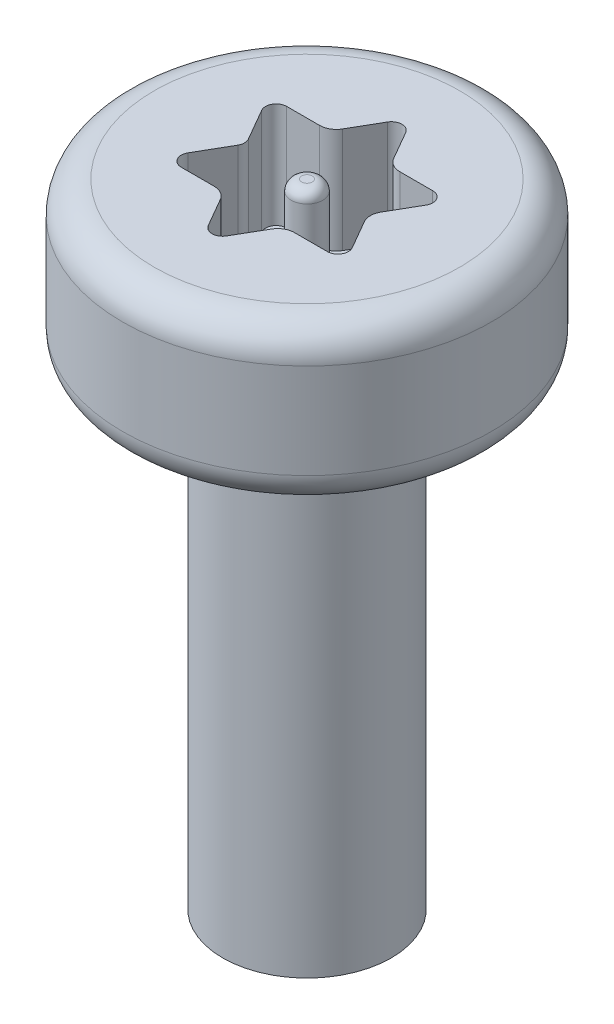
ISO-10303-21;
HEADER;
FILE_DESCRIPTION(('STEP AP214'),'2;1');
FILE_NAME('part.step','',(''),(''),'','','');
FILE_SCHEMA(('AUTOMOTIVE_DESIGN { 1 0 10303 214 1 1 1 1 }'));
ENDSEC;
DATA;
#1=APPLICATION_CONTEXT('core data for automotive mechanical design processes');
#2=APPLICATION_PROTOCOL_DEFINITION('international standard','automotive_design',2000,#1);
#3=PRODUCT_CONTEXT('',#1,'mechanical');
#4=PRODUCT('Part','Part','',(#3));
#5=PRODUCT_RELATED_PRODUCT_CATEGORY('part','',(#4));
#6=PRODUCT_DEFINITION_FORMATION('','',#4);
#7=PRODUCT_DEFINITION_CONTEXT('part definition',#1,'design');
#8=PRODUCT_DEFINITION('design','',#6,#7);
#9=PRODUCT_DEFINITION_SHAPE('','',#8);
#10=(LENGTH_UNIT() NAMED_UNIT(*) SI_UNIT(.MILLI.,.METRE.));
#11=(NAMED_UNIT(*) PLANE_ANGLE_UNIT() SI_UNIT($,.RADIAN.));
#12=(NAMED_UNIT(*) SI_UNIT($,.STERADIAN.) SOLID_ANGLE_UNIT());
#13=UNCERTAINTY_MEASURE_WITH_UNIT(LENGTH_MEASURE(1.E-05),#10,'distance_accuracy_value','');
#14=(GEOMETRIC_REPRESENTATION_CONTEXT(3) GLOBAL_UNCERTAINTY_ASSIGNED_CONTEXT((#13)) GLOBAL_UNIT_ASSIGNED_CONTEXT((#10,
#11,#12)) REPRESENTATION_CONTEXT('',''));
#15=CARTESIAN_POINT('',(0.,0.,0.));
#16=DIRECTION('',(0.,0.,1.));
#17=DIRECTION('',(1.,0.,0.));
#18=AXIS2_PLACEMENT_3D('',#15,#16,#17);
#19=CARTESIAN_POINT('',(0.,0.,0.));
#20=DIRECTION('',(0.,1.,0.));
#21=DIRECTION('',(0.,0.,1.));
#22=AXIS2_PLACEMENT_3D('',#19,#20,#21);
#23=PLANE('',#22);
#24=CARTESIAN_POINT('',(0.,0.,0.));
#25=DIRECTION('',(0.,1.,0.));
#26=DIRECTION('',(0.,0.,1.));
#27=AXIS2_PLACEMENT_3D('',#24,#25,#26);
#28=CIRCLE('',#27,1.45);
#29=CARTESIAN_POINT('',(0.,0.,1.45));
#30=VERTEX_POINT('',#29);
#31=EDGE_CURVE('E378',#30,#30,#28,.F.);
#32=ORIENTED_EDGE('',*,*,#31,.T.);
#33=EDGE_LOOP('',(#32));
#34=FACE_BOUND('',#33,.T.);
#35=CARTESIAN_POINT('',(0.,0.,0.));
#36=DIRECTION('',(0.,1.,0.));
#37=DIRECTION('',(0.,0.,1.));
#38=AXIS2_PLACEMENT_3D('',#35,#36,#37);
#39=CIRCLE('',#38,0.8);
#40=CARTESIAN_POINT('',(0.,0.,0.8));
#41=VERTEX_POINT('',#40);
#42=EDGE_CURVE('E369',#41,#41,#39,.F.);
#43=ORIENTED_EDGE('',*,*,#42,.F.);
#44=EDGE_LOOP('',(#43));
#45=FACE_BOUND('',#44,.T.);
#46=ADVANCED_FACE('F16',(#34,#45),#23,.F.);
#47=CARTESIAN_POINT('',(0.,0.5,0.));
#48=DIRECTION('',(0.,1.,0.));
#49=DIRECTION('',(0.,0.,1.));
#50=AXIS2_PLACEMENT_3D('',#47,#48,#49);
#51=PLANE('',#50);
#52=DIRECTION('',(-0.5,0.,-0.86602540378444));
#53=VECTOR('',#52,1.);
#54=CARTESIAN_POINT('',(-0.43301270189222,0.5,0.25));
#55=LINE('',#54,#53);
#56=CARTESIAN_POINT('',(-0.606217782649111,0.5,-0.0500000000000079));
#57=VERTEX_POINT('',#56);
#58=CARTESIAN_POINT('',(-0.779422863405994,0.5,-0.35));
#59=VERTEX_POINT('',#58);
#60=EDGE_CURVE('E203',#57,#59,#55,.T.);
#61=ORIENTED_EDGE('',*,*,#60,.F.);
#62=CARTESIAN_POINT('',(-0.692820323027554,0.5,0.));
#63=DIRECTION('',(0.,1.,0.));
#64=DIRECTION('',(0.,0.,1.));
#65=AXIS2_PLACEMENT_3D('',#62,#63,#64);
#66=CIRCLE('',#65,0.1);
#67=CARTESIAN_POINT('',(-0.606217782649111,0.5,0.0499999999999924));
#68=VERTEX_POINT('',#67);
#69=EDGE_CURVE('E201',#57,#68,#66,.F.);
#70=ORIENTED_EDGE('',*,*,#69,.T.);
#71=DIRECTION('',(-0.50000000000001,0.,0.866025403784433));
#72=VECTOR('',#71,1.);
#73=CARTESIAN_POINT('',(-0.43301270189222,0.5,-0.250000000000006));
#74=LINE('',#73,#72);
#75=CARTESIAN_POINT('',(-0.779422863405999,0.5,0.349999999999986));
#76=VERTEX_POINT('',#75);
#77=EDGE_CURVE('E183',#68,#76,#74,.T.);
#78=ORIENTED_EDGE('',*,*,#77,.T.);
#79=CARTESIAN_POINT('',(-0.692820323027556,0.5,0.399999999999987));
#80=DIRECTION('',(0.,1.,0.));
#81=DIRECTION('',(0.,0.,1.));
#82=AXIS2_PLACEMENT_3D('',#79,#80,#81);
#83=CIRCLE('',#82,0.1);
#84=CARTESIAN_POINT('',(-0.692820323027556,0.5,0.499999999999987));
#85=VERTEX_POINT('',#84);
#86=EDGE_CURVE('E192',#76,#85,#83,.T.);
#87=ORIENTED_EDGE('',*,*,#86,.T.);
#88=DIRECTION('',(1.,0.,0.));
#89=VECTOR('',#88,1.);
#90=CARTESIAN_POINT('',(0.,0.5,0.499999999999987));
#91=LINE('',#90,#89);
#92=CARTESIAN_POINT('',(-0.38043258809103,0.5,0.499999999999987));
#93=VERTEX_POINT('',#92);
#94=EDGE_CURVE('E31',#85,#93,#91,.T.);
#95=ORIENTED_EDGE('',*,*,#94,.T.);
#96=CARTESIAN_POINT('',(-0.380432588091029,0.5,0.658928571428559));
#97=DIRECTION('',(0.,1.,0.));
#98=DIRECTION('',(0.,0.,1.));
#99=AXIS2_PLACEMENT_3D('',#96,#97,#98);
#100=CIRCLE('',#99,0.158928571428572);
#101=CARTESIAN_POINT('',(-0.242796407846716,0.5,0.579464285714273));
#102=VERTEX_POINT('',#101);
#103=EDGE_CURVE('E39',#93,#102,#100,.F.);
#104=ORIENTED_EDGE('',*,*,#103,.T.);
#105=DIRECTION('',(-0.5,0.,-0.86602540378444));
#106=VECTOR('',#105,1.);
#107=CARTESIAN_POINT('',(-0.43301270189222,0.5,0.25));
#108=LINE('',#107,#106);
#109=CARTESIAN_POINT('',(-0.0866025403784443,0.5,0.85));
#110=VERTEX_POINT('',#109);
#111=EDGE_CURVE('E209',#110,#102,#108,.T.);
#112=ORIENTED_EDGE('',*,*,#111,.F.);
#113=CARTESIAN_POINT('',(0.,0.5,0.8));
#114=DIRECTION('',(0.,1.,0.));
#115=DIRECTION('',(0.,0.,1.));
#116=AXIS2_PLACEMENT_3D('',#113,#114,#115);
#117=CIRCLE('',#116,0.1);
#118=CARTESIAN_POINT('',(0.0866025403784443,0.5,0.85));
#119=VERTEX_POINT('',#118);
#120=EDGE_CURVE('E211',#110,#119,#117,.T.);
#121=ORIENTED_EDGE('',*,*,#120,.T.);
#122=DIRECTION('',(-0.5,0.,0.86602540378444));
#123=VECTOR('',#122,1.);
#124=CARTESIAN_POINT('',(0.43301270189222,0.5,0.25));
#125=LINE('',#124,#123);
#126=CARTESIAN_POINT('',(0.242796407846716,0.5,0.579464285714273));
#127=VERTEX_POINT('',#126);
#128=EDGE_CURVE('E214',#127,#119,#125,.T.);
#129=ORIENTED_EDGE('',*,*,#128,.F.);
#130=CARTESIAN_POINT('',(0.380432588091029,0.5,0.658928571428559));
#131=DIRECTION('',(0.,1.,0.));
#132=DIRECTION('',(0.,0.,1.));
#133=AXIS2_PLACEMENT_3D('',#130,#131,#132);
#134=CIRCLE('',#133,0.158928571428572);
#135=CARTESIAN_POINT('',(0.38043258809103,0.5,0.499999999999987));
#136=VERTEX_POINT('',#135);
#137=EDGE_CURVE('E216',#127,#136,#134,.F.);
#138=ORIENTED_EDGE('',*,*,#137,.T.);
#139=DIRECTION('',(1.,0.,0.));
#140=VECTOR('',#139,1.);
#141=CARTESIAN_POINT('',(0.,0.5,0.499999999999987));
#142=LINE('',#141,#140);
#143=CARTESIAN_POINT('',(0.692820323027556,0.5,0.499999999999987));
#144=VERTEX_POINT('',#143);
#145=EDGE_CURVE('E219',#136,#144,#142,.T.);
#146=ORIENTED_EDGE('',*,*,#145,.T.);
#147=CARTESIAN_POINT('',(0.692820323027556,0.5,0.399999999999987));
#148=DIRECTION('',(0.,1.,0.));
#149=DIRECTION('',(0.,0.,1.));
#150=AXIS2_PLACEMENT_3D('',#147,#148,#149);
#151=CIRCLE('',#150,0.1);
#152=CARTESIAN_POINT('',(0.779422863405999,0.5,0.349999999999986));
#153=VERTEX_POINT('',#152);
#154=EDGE_CURVE('E222',#144,#153,#151,.T.);
#155=ORIENTED_EDGE('',*,*,#154,.T.);
#156=DIRECTION('',(-0.500000000000009,0.,-0.866025403784434));
#157=VECTOR('',#156,1.);
#158=CARTESIAN_POINT('',(0.43301270189222,0.5,-0.250000000000006));
#159=LINE('',#158,#157);
#160=CARTESIAN_POINT('',(0.623228995937734,0.5,0.0794642857142784));
#161=VERTEX_POINT('',#160);
#162=EDGE_CURVE('E225',#153,#161,#159,.T.);
#163=ORIENTED_EDGE('',*,*,#162,.T.);
#164=CARTESIAN_POINT('',(0.760865176182047,0.5,0.));
#165=DIRECTION('',(0.,1.,0.));
#166=DIRECTION('',(0.,0.,1.));
#167=AXIS2_PLACEMENT_3D('',#164,#165,#166);
#168=CIRCLE('',#167,0.158928571428572);
#169=CARTESIAN_POINT('',(0.623228995937734,0.5,-0.0794642857142939));
#170=VERTEX_POINT('',#169);
#171=EDGE_CURVE('E228',#161,#170,#168,.F.);
#172=ORIENTED_EDGE('',*,*,#171,.T.);
#173=DIRECTION('',(-0.5,0.,0.86602540378444));
#174=VECTOR('',#173,1.);
#175=CARTESIAN_POINT('',(0.43301270189222,0.5,0.25));
#176=LINE('',#175,#174);
#177=CARTESIAN_POINT('',(0.779422863405994,0.5,-0.35));
#178=VERTEX_POINT('',#177);
#179=EDGE_CURVE('E231',#178,#170,#176,.T.);
#180=ORIENTED_EDGE('',*,*,#179,.F.);
#181=CARTESIAN_POINT('',(0.692820323027549,0.5,-0.4));
#182=DIRECTION('',(0.,1.,0.));
#183=DIRECTION('',(0.,0.,1.));
#184=AXIS2_PLACEMENT_3D('',#181,#182,#183);
#185=CIRCLE('',#184,0.1);
#186=CARTESIAN_POINT('',(0.692820323027549,0.5,-0.5));
#187=VERTEX_POINT('',#186);
#188=EDGE_CURVE('E233',#178,#187,#185,.T.);
#189=ORIENTED_EDGE('',*,*,#188,.T.);
#190=DIRECTION('',(1.,0.,0.));
#191=VECTOR('',#190,1.);
#192=CARTESIAN_POINT('',(0.,0.5,-0.5));
#193=LINE('',#192,#191);
#194=CARTESIAN_POINT('',(0.380432588091023,0.5,-0.5));
#195=VERTEX_POINT('',#194);
#196=EDGE_CURVE('E236',#195,#187,#193,.T.);
#197=ORIENTED_EDGE('',*,*,#196,.F.);
#198=CARTESIAN_POINT('',(0.380432588091023,0.5,-0.658928571428573));
#199=DIRECTION('',(0.,1.,0.));
#200=DIRECTION('',(0.,0.,1.));
#201=AXIS2_PLACEMENT_3D('',#198,#199,#200);
#202=CIRCLE('',#201,0.158928571428571);
#203=CARTESIAN_POINT('',(0.242796407846711,0.5,-0.579464285714288));
#204=VERTEX_POINT('',#203);
#205=EDGE_CURVE('E238',#195,#204,#202,.F.);
#206=ORIENTED_EDGE('',*,*,#205,.T.);
#207=DIRECTION('',(-0.500000000000014,0.,-0.866025403784431));
#208=VECTOR('',#207,1.);
#209=CARTESIAN_POINT('',(0.433012701892223,0.5,-0.250000000000011));
#210=LINE('',#209,#208);
#211=CARTESIAN_POINT('',(0.0866025403784432,0.5,-0.85));
#212=VERTEX_POINT('',#211);
#213=EDGE_CURVE('E241',#204,#212,#210,.T.);
#214=ORIENTED_EDGE('',*,*,#213,.T.);
#215=CARTESIAN_POINT('',(0.,0.5,-0.8));
#216=DIRECTION('',(0.,1.,0.));
#217=DIRECTION('',(0.,0.,1.));
#218=AXIS2_PLACEMENT_3D('',#215,#216,#217);
#219=CIRCLE('',#218,0.1);
#220=CARTESIAN_POINT('',(-0.0866025403784435,0.5,-0.85));
#221=VERTEX_POINT('',#220);
#222=EDGE_CURVE('E244',#212,#221,#219,.T.);
#223=ORIENTED_EDGE('',*,*,#222,.T.);
#224=DIRECTION('',(-0.500000000000014,0.,0.866025403784431));
#225=VECTOR('',#224,1.);
#226=CARTESIAN_POINT('',(-0.433012701892223,0.5,-0.250000000000011));
#227=LINE('',#226,#225);
#228=CARTESIAN_POINT('',(-0.242796407846711,0.5,-0.579464285714288));
#229=VERTEX_POINT('',#228);
#230=EDGE_CURVE('E247',#221,#229,#227,.T.);
#231=ORIENTED_EDGE('',*,*,#230,.T.);
#232=CARTESIAN_POINT('',(-0.380432588091023,0.5,-0.658928571428574));
#233=DIRECTION('',(0.,1.,0.));
#234=DIRECTION('',(0.,0.,1.));
#235=AXIS2_PLACEMENT_3D('',#232,#233,#234);
#236=CIRCLE('',#235,0.158928571428572);
#237=CARTESIAN_POINT('',(-0.380432588091023,0.5,-0.5));
#238=VERTEX_POINT('',#237);
#239=EDGE_CURVE('E250',#229,#238,#236,.F.);
#240=ORIENTED_EDGE('',*,*,#239,.T.);
#241=DIRECTION('',(1.,0.,0.));
#242=VECTOR('',#241,1.);
#243=CARTESIAN_POINT('',(0.,0.5,-0.5));
#244=LINE('',#243,#242);
#245=CARTESIAN_POINT('',(-0.692820323027549,0.5,-0.5));
#246=VERTEX_POINT('',#245);
#247=EDGE_CURVE('E253',#246,#238,#244,.T.);
#248=ORIENTED_EDGE('',*,*,#247,.F.);
#249=CARTESIAN_POINT('',(-0.692820323027549,0.5,-0.4));
#250=DIRECTION('',(0.,1.,0.));
#251=DIRECTION('',(0.,0.,1.));
#252=AXIS2_PLACEMENT_3D('',#249,#250,#251);
#253=CIRCLE('',#252,0.1);
#254=EDGE_CURVE('E255',#246,#59,#253,.T.);
#255=ORIENTED_EDGE('',*,*,#254,.T.);
#256=EDGE_LOOP('',(#61,#70,#78,#87,#95,#104,#112,#121,#129,#138,#146,#155,#163,#172,#180,#189,
#197,#206,#214,#223,#231,#240,#248,#255));
#257=FACE_BOUND('',#256,.T.);
#258=CARTESIAN_POINT('',(0.,0.5,0.));
#259=DIRECTION('',(0.,1.,0.));
#260=DIRECTION('',(0.,0.,1.));
#261=AXIS2_PLACEMENT_3D('',#258,#259,#260);
#262=CIRCLE('',#261,0.15);
#263=CARTESIAN_POINT('',(0.,0.5,0.15));
#264=VERTEX_POINT('',#263);
#265=EDGE_CURVE('E523',#264,#264,#262,.T.);
#266=ORIENTED_EDGE('',*,*,#265,.F.);
#267=EDGE_LOOP('',(#266));
#268=FACE_BOUND('',#267,.T.);
#269=ADVANCED_FACE('F199',(#257,#268),#51,.T.);
#270=CARTESIAN_POINT('',(0.,1.5,0.));
#271=DIRECTION('',(0.,1.,0.));
#272=DIRECTION('',(0.,0.,1.));
#273=AXIS2_PLACEMENT_3D('',#270,#271,#272);
#274=PLANE('',#273);
#275=CARTESIAN_POINT('',(0.,1.5,0.));
#276=DIRECTION('',(0.,1.,0.));
#277=DIRECTION('',(0.,0.,1.));
#278=AXIS2_PLACEMENT_3D('',#275,#276,#277);
#279=CIRCLE('',#278,1.45);
#280=CARTESIAN_POINT('',(0.,1.5,1.45));
#281=VERTEX_POINT('',#280);
#282=EDGE_CURVE('E381',#281,#281,#279,.T.);
#283=ORIENTED_EDGE('',*,*,#282,.T.);
#284=EDGE_LOOP('',(#283));
#285=FACE_BOUND('',#284,.T.);
#286=DIRECTION('',(1.,0.,0.));
#287=VECTOR('',#286,1.);
#288=CARTESIAN_POINT('',(-0.692820323027556,1.5,0.499999999999987));
#289=LINE('',#288,#287);
#290=CARTESIAN_POINT('',(-0.692820323027556,1.5,0.499999999999987));
#291=VERTEX_POINT('',#290);
#292=CARTESIAN_POINT('',(-0.38043258809103,1.5,0.499999999999987));
#293=VERTEX_POINT('',#292);
#294=EDGE_CURVE('E260',#291,#293,#289,.T.);
#295=ORIENTED_EDGE('',*,*,#294,.F.);
#296=CARTESIAN_POINT('',(-0.692820323027556,1.5,0.399999999999987));
#297=DIRECTION('',(0.,1.,0.));
#298=DIRECTION('',(0.,0.,1.));
#299=AXIS2_PLACEMENT_3D('',#296,#297,#298);
#300=CIRCLE('',#299,0.1);
#301=CARTESIAN_POINT('',(-0.779422863405999,1.5,0.349999999999986));
#302=VERTEX_POINT('',#301);
#303=EDGE_CURVE('E258',#302,#291,#300,.T.);
#304=ORIENTED_EDGE('',*,*,#303,.F.);
#305=DIRECTION('',(-0.500000000000009,0.,0.866025403784433));
#306=VECTOR('',#305,1.);
#307=CARTESIAN_POINT('',(-0.606217782649111,1.5,0.0499999999999924));
#308=LINE('',#307,#306);
#309=CARTESIAN_POINT('',(-0.606217782649111,1.5,0.0499999999999924));
#310=VERTEX_POINT('',#309);
#311=EDGE_CURVE('E186',#310,#302,#308,.T.);
#312=ORIENTED_EDGE('',*,*,#311,.F.);
#313=CARTESIAN_POINT('',(-0.692820323027554,1.5,0.));
#314=DIRECTION('',(0.,-1.,0.));
#315=DIRECTION('',(0.,0.,-1.));
#316=AXIS2_PLACEMENT_3D('',#313,#314,#315);
#317=CIRCLE('',#316,0.1);
#318=CARTESIAN_POINT('',(-0.606217782649111,1.5,-0.0500000000000079));
#319=VERTEX_POINT('',#318);
#320=EDGE_CURVE('E302',#319,#310,#317,.T.);
#321=ORIENTED_EDGE('',*,*,#320,.F.);
#322=DIRECTION('',(0.5,0.,0.866025403784439));
#323=VECTOR('',#322,1.);
#324=CARTESIAN_POINT('',(-0.60621778264911,1.5,-0.0500000000000079));
#325=LINE('',#324,#323);
#326=CARTESIAN_POINT('',(-0.779422863405994,1.5,-0.35));
#327=VERTEX_POINT('',#326);
#328=EDGE_CURVE('E300',#327,#319,#325,.T.);
#329=ORIENTED_EDGE('',*,*,#328,.F.);
#330=CARTESIAN_POINT('',(-0.692820323027549,1.5,-0.4));
#331=DIRECTION('',(0.,1.,0.));
#332=DIRECTION('',(0.,0.,1.));
#333=AXIS2_PLACEMENT_3D('',#330,#331,#332);
#334=CIRCLE('',#333,0.1);
#335=CARTESIAN_POINT('',(-0.692820323027549,1.5,-0.5));
#336=VERTEX_POINT('',#335);
#337=EDGE_CURVE('E298',#336,#327,#334,.T.);
#338=ORIENTED_EDGE('',*,*,#337,.F.);
#339=DIRECTION('',(-1.,0.,0.));
#340=VECTOR('',#339,1.);
#341=CARTESIAN_POINT('',(-0.692820323027549,1.5,-0.5));
#342=LINE('',#341,#340);
#343=CARTESIAN_POINT('',(-0.380432588091023,1.5,-0.5));
#344=VERTEX_POINT('',#343);
#345=EDGE_CURVE('E296',#344,#336,#342,.T.);
#346=ORIENTED_EDGE('',*,*,#345,.F.);
#347=CARTESIAN_POINT('',(-0.380432588091023,1.5,-0.658928571428574));
#348=DIRECTION('',(0.,-1.,0.));
#349=DIRECTION('',(0.,0.,-1.));
#350=AXIS2_PLACEMENT_3D('',#347,#348,#349);
#351=CIRCLE('',#350,0.158928571428572);
#352=CARTESIAN_POINT('',(-0.242796407846711,1.5,-0.579464285714288));
#353=VERTEX_POINT('',#352);
#354=EDGE_CURVE('E294',#353,#344,#351,.T.);
#355=ORIENTED_EDGE('',*,*,#354,.F.);
#356=DIRECTION('',(-0.500000000000014,0.,0.86602540378443));
#357=VECTOR('',#356,1.);
#358=CARTESIAN_POINT('',(-0.0866025403784435,1.5,-0.85));
#359=LINE('',#358,#357);
#360=CARTESIAN_POINT('',(-0.0866025403784435,1.5,-0.85));
#361=VERTEX_POINT('',#360);
#362=EDGE_CURVE('E292',#361,#353,#359,.T.);
#363=ORIENTED_EDGE('',*,*,#362,.F.);
#364=CARTESIAN_POINT('',(0.,1.5,-0.8));
#365=DIRECTION('',(0.,1.,0.));
#366=DIRECTION('',(0.,0.,1.));
#367=AXIS2_PLACEMENT_3D('',#364,#365,#366);
#368=CIRCLE('',#367,0.1);
#369=CARTESIAN_POINT('',(0.0866025403784432,1.5,-0.85));
#370=VERTEX_POINT('',#369);
#371=EDGE_CURVE('E290',#370,#361,#368,.T.);
#372=ORIENTED_EDGE('',*,*,#371,.F.);
#373=DIRECTION('',(-0.500000000000014,0.,-0.86602540378443));
#374=VECTOR('',#373,1.);
#375=CARTESIAN_POINT('',(0.242796407846711,1.5,-0.579464285714288));
#376=LINE('',#375,#374);
#377=CARTESIAN_POINT('',(0.242796407846711,1.5,-0.579464285714288));
#378=VERTEX_POINT('',#377);
#379=EDGE_CURVE('E288',#378,#370,#376,.T.);
#380=ORIENTED_EDGE('',*,*,#379,.F.);
#381=CARTESIAN_POINT('',(0.380432588091023,1.5,-0.658928571428573));
#382=DIRECTION('',(0.,-1.,0.));
#383=DIRECTION('',(0.,0.,-1.));
#384=AXIS2_PLACEMENT_3D('',#381,#382,#383);
#385=CIRCLE('',#384,0.158928571428571);
#386=CARTESIAN_POINT('',(0.380432588091023,1.5,-0.5));
#387=VERTEX_POINT('',#386);
#388=EDGE_CURVE('E286',#387,#378,#385,.T.);
#389=ORIENTED_EDGE('',*,*,#388,.F.);
#390=DIRECTION('',(-1.,0.,0.));
#391=VECTOR('',#390,1.);
#392=CARTESIAN_POINT('',(0.380432588091023,1.5,-0.5));
#393=LINE('',#392,#391);
#394=CARTESIAN_POINT('',(0.692820323027549,1.5,-0.5));
#395=VERTEX_POINT('',#394);
#396=EDGE_CURVE('E284',#395,#387,#393,.T.);
#397=ORIENTED_EDGE('',*,*,#396,.F.);
#398=CARTESIAN_POINT('',(0.692820323027549,1.5,-0.4));
#399=DIRECTION('',(0.,1.,0.));
#400=DIRECTION('',(0.,0.,1.));
#401=AXIS2_PLACEMENT_3D('',#398,#399,#400);
#402=CIRCLE('',#401,0.1);
#403=CARTESIAN_POINT('',(0.779422863405994,1.5,-0.35));
#404=VERTEX_POINT('',#403);
#405=EDGE_CURVE('E282',#404,#395,#402,.T.);
#406=ORIENTED_EDGE('',*,*,#405,.F.);
#407=DIRECTION('',(0.5,0.,-0.86602540378444));
#408=VECTOR('',#407,1.);
#409=CARTESIAN_POINT('',(0.779422863405994,1.5,-0.35));
#410=LINE('',#409,#408);
#411=CARTESIAN_POINT('',(0.623228995937734,1.5,-0.0794642857142939));
#412=VERTEX_POINT('',#411);
#413=EDGE_CURVE('E280',#412,#404,#410,.T.);
#414=ORIENTED_EDGE('',*,*,#413,.F.);
#415=CARTESIAN_POINT('',(0.760865176182047,1.5,0.));
#416=DIRECTION('',(0.,-1.,0.));
#417=DIRECTION('',(0.,0.,-1.));
#418=AXIS2_PLACEMENT_3D('',#415,#416,#417);
#419=CIRCLE('',#418,0.158928571428572);
#420=CARTESIAN_POINT('',(0.623228995937734,1.5,0.0794642857142784));
#421=VERTEX_POINT('',#420);
#422=EDGE_CURVE('E278',#421,#412,#419,.T.);
#423=ORIENTED_EDGE('',*,*,#422,.F.);
#424=DIRECTION('',(-0.500000000000009,0.,-0.866025403784433));
#425=VECTOR('',#424,1.);
#426=CARTESIAN_POINT('',(0.779422863405999,1.5,0.349999999999986));
#427=LINE('',#426,#425);
#428=CARTESIAN_POINT('',(0.779422863405999,1.5,0.349999999999986));
#429=VERTEX_POINT('',#428);
#430=EDGE_CURVE('E276',#429,#421,#427,.T.);
#431=ORIENTED_EDGE('',*,*,#430,.F.);
#432=CARTESIAN_POINT('',(0.692820323027556,1.5,0.399999999999987));
#433=DIRECTION('',(0.,1.,0.));
#434=DIRECTION('',(0.,0.,1.));
#435=AXIS2_PLACEMENT_3D('',#432,#433,#434);
#436=CIRCLE('',#435,0.1);
#437=CARTESIAN_POINT('',(0.692820323027556,1.5,0.499999999999987));
#438=VERTEX_POINT('',#437);
#439=EDGE_CURVE('E274',#438,#429,#436,.T.);
#440=ORIENTED_EDGE('',*,*,#439,.F.);
#441=DIRECTION('',(1.,0.,0.));
#442=VECTOR('',#441,1.);
#443=CARTESIAN_POINT('',(0.38043258809103,1.5,0.499999999999987));
#444=LINE('',#443,#442);
#445=CARTESIAN_POINT('',(0.38043258809103,1.5,0.499999999999987));
#446=VERTEX_POINT('',#445);
#447=EDGE_CURVE('E272',#446,#438,#444,.T.);
#448=ORIENTED_EDGE('',*,*,#447,.F.);
#449=CARTESIAN_POINT('',(0.380432588091029,1.5,0.658928571428559));
#450=DIRECTION('',(0.,-1.,0.));
#451=DIRECTION('',(0.,0.,-1.));
#452=AXIS2_PLACEMENT_3D('',#449,#450,#451);
#453=CIRCLE('',#452,0.158928571428572);
#454=CARTESIAN_POINT('',(0.242796407846716,1.5,0.579464285714273));
#455=VERTEX_POINT('',#454);
#456=EDGE_CURVE('E270',#455,#446,#453,.T.);
#457=ORIENTED_EDGE('',*,*,#456,.F.);
#458=DIRECTION('',(0.5,0.,-0.866025403784439));
#459=VECTOR('',#458,1.);
#460=CARTESIAN_POINT('',(0.242796407846716,1.5,0.579464285714273));
#461=LINE('',#460,#459);
#462=CARTESIAN_POINT('',(0.0866025403784443,1.5,0.85));
#463=VERTEX_POINT('',#462);
#464=EDGE_CURVE('E268',#463,#455,#461,.T.);
#465=ORIENTED_EDGE('',*,*,#464,.F.);
#466=CARTESIAN_POINT('',(0.,1.5,0.8));
#467=DIRECTION('',(0.,1.,0.));
#468=DIRECTION('',(0.,0.,1.));
#469=AXIS2_PLACEMENT_3D('',#466,#467,#468);
#470=CIRCLE('',#469,0.1);
#471=CARTESIAN_POINT('',(-0.0866025403784443,1.5,0.85));
#472=VERTEX_POINT('',#471);
#473=EDGE_CURVE('E266',#472,#463,#470,.T.);
#474=ORIENTED_EDGE('',*,*,#473,.F.);
#475=DIRECTION('',(0.5,0.,0.866025403784439));
#476=VECTOR('',#475,1.);
#477=CARTESIAN_POINT('',(-0.0866025403784443,1.5,0.85));
#478=LINE('',#477,#476);
#479=CARTESIAN_POINT('',(-0.242796407846716,1.5,0.579464285714273));
#480=VERTEX_POINT('',#479);
#481=EDGE_CURVE('E264',#480,#472,#478,.T.);
#482=ORIENTED_EDGE('',*,*,#481,.F.);
#483=CARTESIAN_POINT('',(-0.380432588091029,1.5,0.658928571428559));
#484=DIRECTION('',(0.,-1.,0.));
#485=DIRECTION('',(0.,0.,-1.));
#486=AXIS2_PLACEMENT_3D('',#483,#484,#485);
#487=CIRCLE('',#486,0.158928571428572);
#488=EDGE_CURVE('E262',#293,#480,#487,.T.);
#489=ORIENTED_EDGE('',*,*,#488,.F.);
#490=EDGE_LOOP('',(#295,#304,#312,#321,#329,#338,#346,#355,#363,#372,#380,#389,#397,#406,#414,
#423,#431,#440,#448,#457,#465,#474,#482,#489));
#491=FACE_BOUND('',#490,.T.);
#492=ADVANCED_FACE('F406',(#285,#491),#274,.T.);
#493=CARTESIAN_POINT('',(0.,1.5,0.));
#494=DIRECTION('',(0.,-1.,0.));
#495=DIRECTION('',(0.,0.,-1.));
#496=AXIS2_PLACEMENT_3D('',#493,#494,#495);
#497=CYLINDRICAL_SURFACE('',#496,1.75);
#498=CARTESIAN_POINT('',(0.,0.3,0.));
#499=DIRECTION('',(0.,1.,0.));
#500=DIRECTION('',(0.,0.,1.));
#501=AXIS2_PLACEMENT_3D('',#498,#499,#500);
#502=CIRCLE('',#501,1.75);
#503=CARTESIAN_POINT('',(0.,0.3,1.75));
#504=VERTEX_POINT('',#503);
#505=EDGE_CURVE('E375',#504,#504,#502,.T.);
#506=ORIENTED_EDGE('',*,*,#505,.T.);
#507=EDGE_LOOP('',(#506));
#508=FACE_BOUND('',#507,.T.);
#509=CARTESIAN_POINT('',(0.,1.2,0.));
#510=DIRECTION('',(0.,1.,0.));
#511=DIRECTION('',(0.,0.,1.));
#512=AXIS2_PLACEMENT_3D('',#509,#510,#511);
#513=CIRCLE('',#512,1.75);
#514=CARTESIAN_POINT('',(0.,1.2,1.75));
#515=VERTEX_POINT('',#514);
#516=EDGE_CURVE('E372',#515,#515,#513,.F.);
#517=ORIENTED_EDGE('',*,*,#516,.T.);
#518=EDGE_LOOP('',(#517));
#519=FACE_BOUND('',#518,.T.);
#520=ADVANCED_FACE('F412',(#508,#519),#497,.T.);
#521=CARTESIAN_POINT('',(-0.692820323027556,1.5,0.399999999999987));
#522=DIRECTION('',(0.,-1.,0.));
#523=DIRECTION('',(0.,0.,-1.));
#524=AXIS2_PLACEMENT_3D('',#521,#522,#523);
#525=CYLINDRICAL_SURFACE('',#524,0.1);
#526=ORIENTED_EDGE('',*,*,#86,.F.);
#527=DIRECTION('',(0.,-1.,0.));
#528=VECTOR('',#527,1.);
#529=CARTESIAN_POINT('',(-0.779422863405999,1.5,0.349999999999986));
#530=LINE('',#529,#528);
#531=EDGE_CURVE('E179',#302,#76,#530,.T.);
#532=ORIENTED_EDGE('',*,*,#531,.F.);
#533=ORIENTED_EDGE('',*,*,#303,.T.);
#534=DIRECTION('',(0.,-1.,0.));
#535=VECTOR('',#534,1.);
#536=CARTESIAN_POINT('',(-0.692820323027556,1.5,0.499999999999987));
#537=LINE('',#536,#535);
#538=EDGE_CURVE('E194',#291,#85,#537,.T.);
#539=ORIENTED_EDGE('',*,*,#538,.T.);
#540=EDGE_LOOP('',(#526,#532,#533,#539));
#541=FACE_BOUND('',#540,.T.);
#542=ADVANCED_FACE('F193',(#541),#525,.F.);
#543=CARTESIAN_POINT('',(-0.692820323027556,1.5,0.499999999999987));
#544=DIRECTION('',(0.,0.,-1.));
#545=DIRECTION('',(-1.,0.,0.));
#546=AXIS2_PLACEMENT_3D('',#543,#544,#545);
#547=PLANE('',#546);
#548=ORIENTED_EDGE('',*,*,#94,.F.);
#549=ORIENTED_EDGE('',*,*,#538,.F.);
#550=ORIENTED_EDGE('',*,*,#294,.T.);
#551=DIRECTION('',(0.,-1.,0.));
#552=VECTOR('',#551,1.);
#553=CARTESIAN_POINT('',(-0.38043258809103,1.5,0.499999999999987));
#554=LINE('',#553,#552);
#555=EDGE_CURVE('E366',#293,#93,#554,.T.);
#556=ORIENTED_EDGE('',*,*,#555,.T.);
#557=EDGE_LOOP('',(#548,#549,#550,#556));
#558=FACE_BOUND('',#557,.T.);
#559=ADVANCED_FACE('F439',(#558),#547,.T.);
#560=CARTESIAN_POINT('',(-0.380432588091029,1.5,0.658928571428559));
#561=DIRECTION('',(0.,-1.,0.));
#562=DIRECTION('',(0.,0.,-1.));
#563=AXIS2_PLACEMENT_3D('',#560,#561,#562);
#564=CYLINDRICAL_SURFACE('',#563,0.158928571428572);
#565=ORIENTED_EDGE('',*,*,#103,.F.);
#566=ORIENTED_EDGE('',*,*,#555,.F.);
#567=ORIENTED_EDGE('',*,*,#488,.T.);
#568=DIRECTION('',(0.,-1.,0.));
#569=VECTOR('',#568,1.);
#570=CARTESIAN_POINT('',(-0.242796407846716,1.5,0.579464285714273));
#571=LINE('',#570,#569);
#572=EDGE_CURVE('E364',#480,#102,#571,.T.);
#573=ORIENTED_EDGE('',*,*,#572,.T.);
#574=EDGE_LOOP('',(#565,#566,#567,#573));
#575=FACE_BOUND('',#574,.T.);
#576=ADVANCED_FACE('F440',(#575),#564,.T.);
#577=CARTESIAN_POINT('',(-0.0866025403784443,1.5,0.85));
#578=DIRECTION('',(0.86602540378444,0.,-0.5));
#579=DIRECTION('',(-0.5,0.,-0.86602540378444));
#580=AXIS2_PLACEMENT_3D('',#577,#578,#579);
#581=PLANE('',#580);
#582=ORIENTED_EDGE('',*,*,#111,.T.);
#583=ORIENTED_EDGE('',*,*,#572,.F.);
#584=ORIENTED_EDGE('',*,*,#481,.T.);
#585=DIRECTION('',(0.,-1.,0.));
#586=VECTOR('',#585,1.);
#587=CARTESIAN_POINT('',(-0.0866025403784443,1.5,0.85));
#588=LINE('',#587,#586);
#589=EDGE_CURVE('E361',#472,#110,#588,.T.);
#590=ORIENTED_EDGE('',*,*,#589,.T.);
#591=EDGE_LOOP('',(#582,#583,#584,#590));
#592=FACE_BOUND('',#591,.T.);
#593=ADVANCED_FACE('F443',(#592),#581,.T.);
#594=CARTESIAN_POINT('',(0.,1.5,0.8));
#595=DIRECTION('',(0.,-1.,0.));
#596=DIRECTION('',(0.,0.,-1.));
#597=AXIS2_PLACEMENT_3D('',#594,#595,#596);
#598=CYLINDRICAL_SURFACE('',#597,0.1);
#599=ORIENTED_EDGE('',*,*,#120,.F.);
#600=ORIENTED_EDGE('',*,*,#589,.F.);
#601=ORIENTED_EDGE('',*,*,#473,.T.);
#602=DIRECTION('',(0.,-1.,0.));
#603=VECTOR('',#602,1.);
#604=CARTESIAN_POINT('',(0.0866025403784443,1.5,0.85));
#605=LINE('',#604,#603);
#606=EDGE_CURVE('E358',#463,#119,#605,.T.);
#607=ORIENTED_EDGE('',*,*,#606,.T.);
#608=EDGE_LOOP('',(#599,#600,#601,#607));
#609=FACE_BOUND('',#608,.T.);
#610=ADVANCED_FACE('F451',(#609),#598,.F.);
#611=CARTESIAN_POINT('',(0.242796407846716,1.5,0.579464285714273));
#612=DIRECTION('',(-0.86602540378444,0.,-0.5));
#613=DIRECTION('',(-0.5,0.,0.86602540378444));
#614=AXIS2_PLACEMENT_3D('',#611,#612,#613);
#615=PLANE('',#614);
#616=ORIENTED_EDGE('',*,*,#128,.T.);
#617=ORIENTED_EDGE('',*,*,#606,.F.);
#618=ORIENTED_EDGE('',*,*,#464,.T.);
#619=DIRECTION('',(0.,-1.,0.));
#620=VECTOR('',#619,1.);
#621=CARTESIAN_POINT('',(0.242796407846716,1.5,0.579464285714273));
#622=LINE('',#621,#620);
#623=EDGE_CURVE('E355',#455,#127,#622,.T.);
#624=ORIENTED_EDGE('',*,*,#623,.T.);
#625=EDGE_LOOP('',(#616,#617,#618,#624));
#626=FACE_BOUND('',#625,.T.);
#627=ADVANCED_FACE('F453',(#626),#615,.T.);
#628=CARTESIAN_POINT('',(0.380432588091029,1.5,0.658928571428559));
#629=DIRECTION('',(0.,-1.,0.));
#630=DIRECTION('',(0.,0.,-1.));
#631=AXIS2_PLACEMENT_3D('',#628,#629,#630);
#632=CYLINDRICAL_SURFACE('',#631,0.158928571428572);
#633=ORIENTED_EDGE('',*,*,#137,.F.);
#634=ORIENTED_EDGE('',*,*,#623,.F.);
#635=ORIENTED_EDGE('',*,*,#456,.T.);
#636=DIRECTION('',(0.,-1.,0.));
#637=VECTOR('',#636,1.);
#638=CARTESIAN_POINT('',(0.38043258809103,1.5,0.499999999999987));
#639=LINE('',#638,#637);
#640=EDGE_CURVE('E352',#446,#136,#639,.T.);
#641=ORIENTED_EDGE('',*,*,#640,.T.);
#642=EDGE_LOOP('',(#633,#634,#635,#641));
#643=FACE_BOUND('',#642,.T.);
#644=ADVANCED_FACE('F457',(#643),#632,.T.);
#645=CARTESIAN_POINT('',(0.38043258809103,1.5,0.499999999999987));
#646=DIRECTION('',(0.,0.,-1.));
#647=DIRECTION('',(-1.,0.,0.));
#648=AXIS2_PLACEMENT_3D('',#645,#646,#647);
#649=PLANE('',#648);
#650=ORIENTED_EDGE('',*,*,#145,.F.);
#651=ORIENTED_EDGE('',*,*,#640,.F.);
#652=ORIENTED_EDGE('',*,*,#447,.T.);
#653=DIRECTION('',(0.,-1.,0.));
#654=VECTOR('',#653,1.);
#655=CARTESIAN_POINT('',(0.692820323027556,1.5,0.499999999999987));
#656=LINE('',#655,#654);
#657=EDGE_CURVE('E349',#438,#144,#656,.T.);
#658=ORIENTED_EDGE('',*,*,#657,.T.);
#659=EDGE_LOOP('',(#650,#651,#652,#658));
#660=FACE_BOUND('',#659,.T.);
#661=ADVANCED_FACE('F461',(#660),#649,.T.);
#662=CARTESIAN_POINT('',(0.692820323027556,1.5,0.399999999999987));
#663=DIRECTION('',(0.,-1.,0.));
#664=DIRECTION('',(0.,0.,-1.));
#665=AXIS2_PLACEMENT_3D('',#662,#663,#664);
#666=CYLINDRICAL_SURFACE('',#665,0.1);
#667=ORIENTED_EDGE('',*,*,#154,.F.);
#668=ORIENTED_EDGE('',*,*,#657,.F.);
#669=ORIENTED_EDGE('',*,*,#439,.T.);
#670=DIRECTION('',(0.,-1.,0.));
#671=VECTOR('',#670,1.);
#672=CARTESIAN_POINT('',(0.779422863405999,1.5,0.349999999999986));
#673=LINE('',#672,#671);
#674=EDGE_CURVE('E346',#429,#153,#673,.T.);
#675=ORIENTED_EDGE('',*,*,#674,.T.);
#676=EDGE_LOOP('',(#667,#668,#669,#675));
#677=FACE_BOUND('',#676,.T.);
#678=ADVANCED_FACE('F468',(#677),#666,.F.);
#679=CARTESIAN_POINT('',(0.779422863405999,1.5,0.349999999999986));
#680=DIRECTION('',(-0.866025403784434,0.,0.500000000000009));
#681=DIRECTION('',(0.500000000000009,0.,0.866025403784434));
#682=AXIS2_PLACEMENT_3D('',#679,#680,#681);
#683=PLANE('',#682);
#684=ORIENTED_EDGE('',*,*,#162,.F.);
#685=ORIENTED_EDGE('',*,*,#674,.F.);
#686=ORIENTED_EDGE('',*,*,#430,.T.);
#687=DIRECTION('',(0.,-1.,0.));
#688=VECTOR('',#687,1.);
#689=CARTESIAN_POINT('',(0.623228995937734,1.5,0.0794642857142784));
#690=LINE('',#689,#688);
#691=EDGE_CURVE('E343',#421,#161,#690,.T.);
#692=ORIENTED_EDGE('',*,*,#691,.T.);
#693=EDGE_LOOP('',(#684,#685,#686,#692));
#694=FACE_BOUND('',#693,.T.);
#695=ADVANCED_FACE('F470',(#694),#683,.T.);
#696=CARTESIAN_POINT('',(0.760865176182047,1.5,0.));
#697=DIRECTION('',(0.,-1.,0.));
#698=DIRECTION('',(0.,0.,-1.));
#699=AXIS2_PLACEMENT_3D('',#696,#697,#698);
#700=CYLINDRICAL_SURFACE('',#699,0.158928571428572);
#701=ORIENTED_EDGE('',*,*,#171,.F.);
#702=ORIENTED_EDGE('',*,*,#691,.F.);
#703=ORIENTED_EDGE('',*,*,#422,.T.);
#704=DIRECTION('',(0.,-1.,0.));
#705=VECTOR('',#704,1.);
#706=CARTESIAN_POINT('',(0.623228995937734,1.5,-0.0794642857142939));
#707=LINE('',#706,#705);
#708=EDGE_CURVE('E340',#412,#170,#707,.T.);
#709=ORIENTED_EDGE('',*,*,#708,.T.);
#710=EDGE_LOOP('',(#701,#702,#703,#709));
#711=FACE_BOUND('',#710,.T.);
#712=ADVANCED_FACE('F474',(#711),#700,.T.);
#713=CARTESIAN_POINT('',(0.779422863405994,1.5,-0.35));
#714=DIRECTION('',(-0.86602540378444,0.,-0.5));
#715=DIRECTION('',(-0.5,0.,0.86602540378444));
#716=AXIS2_PLACEMENT_3D('',#713,#714,#715);
#717=PLANE('',#716);
#718=ORIENTED_EDGE('',*,*,#179,.T.);
#719=ORIENTED_EDGE('',*,*,#708,.F.);
#720=ORIENTED_EDGE('',*,*,#413,.T.);
#721=DIRECTION('',(0.,-1.,0.));
#722=VECTOR('',#721,1.);
#723=CARTESIAN_POINT('',(0.779422863405994,1.5,-0.35));
#724=LINE('',#723,#722);
#725=EDGE_CURVE('E337',#404,#178,#724,.T.);
#726=ORIENTED_EDGE('',*,*,#725,.T.);
#727=EDGE_LOOP('',(#718,#719,#720,#726));
#728=FACE_BOUND('',#727,.T.);
#729=ADVANCED_FACE('F478',(#728),#717,.T.);
#730=CARTESIAN_POINT('',(0.692820323027549,1.5,-0.4));
#731=DIRECTION('',(0.,-1.,0.));
#732=DIRECTION('',(0.,0.,-1.));
#733=AXIS2_PLACEMENT_3D('',#730,#731,#732);
#734=CYLINDRICAL_SURFACE('',#733,0.1);
#735=ORIENTED_EDGE('',*,*,#188,.F.);
#736=ORIENTED_EDGE('',*,*,#725,.F.);
#737=ORIENTED_EDGE('',*,*,#405,.T.);
#738=DIRECTION('',(0.,-1.,0.));
#739=VECTOR('',#738,1.);
#740=CARTESIAN_POINT('',(0.692820323027549,1.5,-0.5));
#741=LINE('',#740,#739);
#742=EDGE_CURVE('E334',#395,#187,#741,.T.);
#743=ORIENTED_EDGE('',*,*,#742,.T.);
#744=EDGE_LOOP('',(#735,#736,#737,#743));
#745=FACE_BOUND('',#744,.T.);
#746=ADVANCED_FACE('F485',(#745),#734,.F.);
#747=CARTESIAN_POINT('',(0.380432588091023,1.5,-0.5));
#748=DIRECTION('',(0.,0.,1.));
#749=DIRECTION('',(1.,0.,0.));
#750=AXIS2_PLACEMENT_3D('',#747,#748,#749);
#751=PLANE('',#750);
#752=ORIENTED_EDGE('',*,*,#196,.T.);
#753=ORIENTED_EDGE('',*,*,#742,.F.);
#754=ORIENTED_EDGE('',*,*,#396,.T.);
#755=DIRECTION('',(0.,-1.,0.));
#756=VECTOR('',#755,1.);
#757=CARTESIAN_POINT('',(0.380432588091023,1.5,-0.5));
#758=LINE('',#757,#756);
#759=EDGE_CURVE('E331',#387,#195,#758,.T.);
#760=ORIENTED_EDGE('',*,*,#759,.T.);
#761=EDGE_LOOP('',(#752,#753,#754,#760));
#762=FACE_BOUND('',#761,.T.);
#763=ADVANCED_FACE('F487',(#762),#751,.T.);
#764=CARTESIAN_POINT('',(0.380432588091023,1.5,-0.658928571428573));
#765=DIRECTION('',(0.,-1.,0.));
#766=DIRECTION('',(0.,0.,-1.));
#767=AXIS2_PLACEMENT_3D('',#764,#765,#766);
#768=CYLINDRICAL_SURFACE('',#767,0.158928571428571);
#769=ORIENTED_EDGE('',*,*,#205,.F.);
#770=ORIENTED_EDGE('',*,*,#759,.F.);
#771=ORIENTED_EDGE('',*,*,#388,.T.);
#772=DIRECTION('',(0.,-1.,0.));
#773=VECTOR('',#772,1.);
#774=CARTESIAN_POINT('',(0.242796407846711,1.5,-0.579464285714288));
#775=LINE('',#774,#773);
#776=EDGE_CURVE('E328',#378,#204,#775,.T.);
#777=ORIENTED_EDGE('',*,*,#776,.T.);
#778=EDGE_LOOP('',(#769,#770,#771,#777));
#779=FACE_BOUND('',#778,.T.);
#780=ADVANCED_FACE('F491',(#779),#768,.T.);
#781=CARTESIAN_POINT('',(0.242796407846711,1.5,-0.579464285714288));
#782=DIRECTION('',(-0.86602540378443,0.,0.500000000000014));
#783=DIRECTION('',(0.500000000000014,0.,0.86602540378443));
#784=AXIS2_PLACEMENT_3D('',#781,#782,#783);
#785=PLANE('',#784);
#786=ORIENTED_EDGE('',*,*,#213,.F.);
#787=ORIENTED_EDGE('',*,*,#776,.F.);
#788=ORIENTED_EDGE('',*,*,#379,.T.);
#789=DIRECTION('',(0.,-1.,0.));
#790=VECTOR('',#789,1.);
#791=CARTESIAN_POINT('',(0.0866025403784432,1.5,-0.85));
#792=LINE('',#791,#790);
#793=EDGE_CURVE('E325',#370,#212,#792,.T.);
#794=ORIENTED_EDGE('',*,*,#793,.T.);
#795=EDGE_LOOP('',(#786,#787,#788,#794));
#796=FACE_BOUND('',#795,.T.);
#797=ADVANCED_FACE('F495',(#796),#785,.T.);
#798=CARTESIAN_POINT('',(0.,1.5,-0.8));
#799=DIRECTION('',(0.,-1.,0.));
#800=DIRECTION('',(0.,0.,-1.));
#801=AXIS2_PLACEMENT_3D('',#798,#799,#800);
#802=CYLINDRICAL_SURFACE('',#801,0.1);
#803=ORIENTED_EDGE('',*,*,#222,.F.);
#804=ORIENTED_EDGE('',*,*,#793,.F.);
#805=ORIENTED_EDGE('',*,*,#371,.T.);
#806=DIRECTION('',(0.,-1.,0.));
#807=VECTOR('',#806,1.);
#808=CARTESIAN_POINT('',(-0.0866025403784435,1.5,-0.85));
#809=LINE('',#808,#807);
#810=EDGE_CURVE('E322',#361,#221,#809,.T.);
#811=ORIENTED_EDGE('',*,*,#810,.T.);
#812=EDGE_LOOP('',(#803,#804,#805,#811));
#813=FACE_BOUND('',#812,.T.);
#814=ADVANCED_FACE('F502',(#813),#802,.F.);
#815=CARTESIAN_POINT('',(-0.0866025403784435,1.5,-0.85));
#816=DIRECTION('',(0.86602540378443,0.,0.500000000000014));
#817=DIRECTION('',(0.500000000000014,0.,-0.86602540378443));
#818=AXIS2_PLACEMENT_3D('',#815,#816,#817);
#819=PLANE('',#818);
#820=ORIENTED_EDGE('',*,*,#230,.F.);
#821=ORIENTED_EDGE('',*,*,#810,.F.);
#822=ORIENTED_EDGE('',*,*,#362,.T.);
#823=DIRECTION('',(0.,-1.,0.));
#824=VECTOR('',#823,1.);
#825=CARTESIAN_POINT('',(-0.242796407846711,1.5,-0.579464285714288));
#826=LINE('',#825,#824);
#827=EDGE_CURVE('E319',#353,#229,#826,.T.);
#828=ORIENTED_EDGE('',*,*,#827,.T.);
#829=EDGE_LOOP('',(#820,#821,#822,#828));
#830=FACE_BOUND('',#829,.T.);
#831=ADVANCED_FACE('F504',(#830),#819,.T.);
#832=CARTESIAN_POINT('',(-0.380432588091023,1.5,-0.658928571428574));
#833=DIRECTION('',(0.,-1.,0.));
#834=DIRECTION('',(0.,0.,-1.));
#835=AXIS2_PLACEMENT_3D('',#832,#833,#834);
#836=CYLINDRICAL_SURFACE('',#835,0.158928571428572);
#837=ORIENTED_EDGE('',*,*,#239,.F.);
#838=ORIENTED_EDGE('',*,*,#827,.F.);
#839=ORIENTED_EDGE('',*,*,#354,.T.);
#840=DIRECTION('',(0.,-1.,0.));
#841=VECTOR('',#840,1.);
#842=CARTESIAN_POINT('',(-0.380432588091023,1.5,-0.5));
#843=LINE('',#842,#841);
#844=EDGE_CURVE('E316',#344,#238,#843,.T.);
#845=ORIENTED_EDGE('',*,*,#844,.T.);
#846=EDGE_LOOP('',(#837,#838,#839,#845));
#847=FACE_BOUND('',#846,.T.);
#848=ADVANCED_FACE('F508',(#847),#836,.T.);
#849=CARTESIAN_POINT('',(-0.692820323027549,1.5,-0.5));
#850=DIRECTION('',(0.,0.,1.));
#851=DIRECTION('',(1.,0.,0.));
#852=AXIS2_PLACEMENT_3D('',#849,#850,#851);
#853=PLANE('',#852);
#854=ORIENTED_EDGE('',*,*,#247,.T.);
#855=ORIENTED_EDGE('',*,*,#844,.F.);
#856=ORIENTED_EDGE('',*,*,#345,.T.);
#857=DIRECTION('',(0.,-1.,0.));
#858=VECTOR('',#857,1.);
#859=CARTESIAN_POINT('',(-0.692820323027549,1.5,-0.5));
#860=LINE('',#859,#858);
#861=EDGE_CURVE('E313',#336,#246,#860,.T.);
#862=ORIENTED_EDGE('',*,*,#861,.T.);
#863=EDGE_LOOP('',(#854,#855,#856,#862));
#864=FACE_BOUND('',#863,.T.);
#865=ADVANCED_FACE('F512',(#864),#853,.T.);
#866=CARTESIAN_POINT('',(-0.692820323027549,1.5,-0.4));
#867=DIRECTION('',(0.,-1.,0.));
#868=DIRECTION('',(0.,0.,-1.));
#869=AXIS2_PLACEMENT_3D('',#866,#867,#868);
#870=CYLINDRICAL_SURFACE('',#869,0.1);
#871=ORIENTED_EDGE('',*,*,#254,.F.);
#872=ORIENTED_EDGE('',*,*,#861,.F.);
#873=ORIENTED_EDGE('',*,*,#337,.T.);
#874=DIRECTION('',(0.,-1.,0.));
#875=VECTOR('',#874,1.);
#876=CARTESIAN_POINT('',(-0.779422863405994,1.5,-0.35));
#877=LINE('',#876,#875);
#878=EDGE_CURVE('E310',#327,#59,#877,.T.);
#879=ORIENTED_EDGE('',*,*,#878,.T.);
#880=EDGE_LOOP('',(#871,#872,#873,#879));
#881=FACE_BOUND('',#880,.T.);
#882=ADVANCED_FACE('F519',(#881),#870,.F.);
#883=CARTESIAN_POINT('',(-0.60621778264911,1.5,-0.0500000000000079));
#884=DIRECTION('',(0.86602540378444,0.,-0.5));
#885=DIRECTION('',(-0.5,0.,-0.86602540378444));
#886=AXIS2_PLACEMENT_3D('',#883,#884,#885);
#887=PLANE('',#886);
#888=ORIENTED_EDGE('',*,*,#60,.T.);
#889=ORIENTED_EDGE('',*,*,#878,.F.);
#890=ORIENTED_EDGE('',*,*,#328,.T.);
#891=DIRECTION('',(0.,-1.,0.));
#892=VECTOR('',#891,1.);
#893=CARTESIAN_POINT('',(-0.606217782649111,1.5,-0.0500000000000079));
#894=LINE('',#893,#892);
#895=EDGE_CURVE('E307',#319,#57,#894,.T.);
#896=ORIENTED_EDGE('',*,*,#895,.T.);
#897=EDGE_LOOP('',(#888,#889,#890,#896));
#898=FACE_BOUND('',#897,.T.);
#899=ADVANCED_FACE('F521',(#898),#887,.T.);
#900=CARTESIAN_POINT('',(-0.692820323027554,1.5,0.));
#901=DIRECTION('',(0.,-1.,0.));
#902=DIRECTION('',(0.,0.,-1.));
#903=AXIS2_PLACEMENT_3D('',#900,#901,#902);
#904=CYLINDRICAL_SURFACE('',#903,0.1);
#905=ORIENTED_EDGE('',*,*,#69,.F.);
#906=ORIENTED_EDGE('',*,*,#895,.F.);
#907=ORIENTED_EDGE('',*,*,#320,.T.);
#908=DIRECTION('',(0.,-1.,0.));
#909=VECTOR('',#908,1.);
#910=CARTESIAN_POINT('',(-0.606217782649111,1.5,0.0499999999999924));
#911=LINE('',#910,#909);
#912=EDGE_CURVE('E189',#310,#68,#911,.T.);
#913=ORIENTED_EDGE('',*,*,#912,.T.);
#914=EDGE_LOOP('',(#905,#906,#907,#913));
#915=FACE_BOUND('',#914,.T.);
#916=ADVANCED_FACE('F547',(#915),#904,.T.);
#917=CARTESIAN_POINT('',(-0.606217782649111,1.5,0.0499999999999924));
#918=DIRECTION('',(0.866025403784433,0.,0.50000000000001));
#919=DIRECTION('',(0.50000000000001,0.,-0.866025403784433));
#920=AXIS2_PLACEMENT_3D('',#917,#918,#919);
#921=PLANE('',#920);
#922=ORIENTED_EDGE('',*,*,#77,.F.);
#923=ORIENTED_EDGE('',*,*,#912,.F.);
#924=ORIENTED_EDGE('',*,*,#311,.T.);
#925=ORIENTED_EDGE('',*,*,#531,.T.);
#926=EDGE_LOOP('',(#922,#923,#924,#925));
#927=FACE_BOUND('',#926,.T.);
#928=ADVANCED_FACE('F181',(#927),#921,.T.);
#929=CARTESIAN_POINT('',(0.,1.5,0.));
#930=DIRECTION('',(0.,-1.,0.));
#931=DIRECTION('',(0.,0.,-1.));
#932=AXIS2_PLACEMENT_3D('',#929,#930,#931);
#933=CYLINDRICAL_SURFACE('',#932,0.15);
#934=CARTESIAN_POINT('',(0.,1.4,0.));
#935=DIRECTION('',(0.,1.,0.));
#936=DIRECTION('',(0.,0.,1.));
#937=AXIS2_PLACEMENT_3D('',#934,#935,#936);
#938=CIRCLE('',#937,0.15);
#939=CARTESIAN_POINT('',(0.,1.4,0.15));
#940=VERTEX_POINT('',#939);
#941=EDGE_CURVE('E11',#940,#940,#938,.F.);
#942=ORIENTED_EDGE('',*,*,#941,.T.);
#943=EDGE_LOOP('',(#942));
#944=FACE_BOUND('',#943,.T.);
#945=ORIENTED_EDGE('',*,*,#265,.T.);
#946=EDGE_LOOP('',(#945));
#947=FACE_BOUND('',#946,.T.);
#948=ADVANCED_FACE('F539',(#944,#947),#933,.T.);
#949=CARTESIAN_POINT('',(0.,1.5,0.));
#950=DIRECTION('',(0.,1.,0.));
#951=DIRECTION('',(0.,0.,1.));
#952=AXIS2_PLACEMENT_3D('',#949,#950,#951);
#953=PLANE('',#952);
#954=CARTESIAN_POINT('',(0.,1.5,0.));
#955=DIRECTION('',(0.,1.,0.));
#956=DIRECTION('',(0.,0.,1.));
#957=AXIS2_PLACEMENT_3D('',#954,#955,#956);
#958=CIRCLE('',#957,0.05);
#959=CARTESIAN_POINT('',(0.,1.5,0.05));
#960=VERTEX_POINT('',#959);
#961=EDGE_CURVE('E24',#960,#960,#958,.T.);
#962=ORIENTED_EDGE('',*,*,#961,.T.);
#963=EDGE_LOOP('',(#962));
#964=FACE_BOUND('',#963,.T.);
#965=ADVANCED_FACE('F386',(#964),#953,.T.);
#966=CARTESIAN_POINT('',(0.,-4.5,0.));
#967=DIRECTION('',(0.,1.,0.));
#968=DIRECTION('',(0.,0.,1.));
#969=AXIS2_PLACEMENT_3D('',#966,#967,#968);
#970=CYLINDRICAL_SURFACE('',#969,0.8);
#971=CARTESIAN_POINT('',(0.,-4.5,0.));
#972=DIRECTION('',(0.,-1.,0.));
#973=DIRECTION('',(0.,0.,-1.));
#974=AXIS2_PLACEMENT_3D('',#971,#972,#973);
#975=CIRCLE('',#974,0.8);
#976=CARTESIAN_POINT('',(0.,-4.5,-0.8));
#977=VERTEX_POINT('',#976);
#978=EDGE_CURVE('E525',#977,#977,#975,.T.);
#979=ORIENTED_EDGE('',*,*,#978,.F.);
#980=EDGE_LOOP('',(#979));
#981=FACE_BOUND('',#980,.T.);
#982=ORIENTED_EDGE('',*,*,#42,.T.);
#983=EDGE_LOOP('',(#982));
#984=FACE_BOUND('',#983,.T.);
#985=ADVANCED_FACE('F423',(#981,#984),#970,.T.);
#986=CARTESIAN_POINT('',(0.,-4.5,0.));
#987=DIRECTION('',(0.,-1.,0.));
#988=DIRECTION('',(0.,0.,-1.));
#989=AXIS2_PLACEMENT_3D('',#986,#987,#988);
#990=PLANE('',#989);
#991=ORIENTED_EDGE('',*,*,#978,.T.);
#992=EDGE_LOOP('',(#991));
#993=FACE_BOUND('',#992,.T.);
#994=ADVANCED_FACE('F417',(#993),#990,.T.);
#995=CARTESIAN_POINT('',(0.,0.3,0.));
#996=DIRECTION('',(0.,1.,0.));
#997=DIRECTION('',(0.,0.,1.));
#998=AXIS2_PLACEMENT_3D('',#995,#996,#997);
#999=TOROIDAL_SURFACE('',#998,1.45,0.3);
#1000=ORIENTED_EDGE('',*,*,#31,.F.);
#1001=EDGE_LOOP('',(#1000));
#1002=FACE_BOUND('',#1001,.T.);
#1003=ORIENTED_EDGE('',*,*,#505,.F.);
#1004=EDGE_LOOP('',(#1003));
#1005=FACE_BOUND('',#1004,.T.);
#1006=ADVANCED_FACE('F396',(#1002,#1005),#999,.T.);
#1007=CARTESIAN_POINT('',(0.,1.2,0.));
#1008=DIRECTION('',(0.,1.,0.));
#1009=DIRECTION('',(0.,0.,1.));
#1010=AXIS2_PLACEMENT_3D('',#1007,#1008,#1009);
#1011=TOROIDAL_SURFACE('',#1010,1.45,0.3);
#1012=ORIENTED_EDGE('',*,*,#516,.F.);
#1013=EDGE_LOOP('',(#1012));
#1014=FACE_BOUND('',#1013,.T.);
#1015=ORIENTED_EDGE('',*,*,#282,.F.);
#1016=EDGE_LOOP('',(#1015));
#1017=FACE_BOUND('',#1016,.T.);
#1018=ADVANCED_FACE('F389',(#1014,#1017),#1011,.T.);
#1019=CARTESIAN_POINT('',(0.,1.4,0.));
#1020=DIRECTION('',(0.,1.,0.));
#1021=DIRECTION('',(0.,0.,1.));
#1022=AXIS2_PLACEMENT_3D('',#1019,#1020,#1021);
#1023=DEGENERATE_TOROIDAL_SURFACE('',#1022,0.05,0.1,.T.);
#1024=ORIENTED_EDGE('',*,*,#941,.F.);
#1025=EDGE_LOOP('',(#1024));
#1026=FACE_BOUND('',#1025,.T.);
#1027=ORIENTED_EDGE('',*,*,#961,.F.);
#1028=EDGE_LOOP('',(#1027));
#1029=FACE_BOUND('',#1028,.T.);
#1030=ADVANCED_FACE('F18',(#1026,#1029),#1023,.T.);
#1031=CLOSED_SHELL('',(#46,#269,#492,#520,#542,#559,#576,#593,#610,#627,#644,#661,#678,#695,
#712,#729,#746,#763,#780,#797,#814,#831,#848,#865,#882,#899,#916,#928,#948,#965,#985,#994,#1006,
#1018,#1030));
#1032=MANIFOLD_SOLID_BREP('B1',#1031);
#1033=ADVANCED_BREP_SHAPE_REPRESENTATION('',(#18,#1032),#14);
#1034=SHAPE_DEFINITION_REPRESENTATION(#9,#1033);
ENDSEC;
END-ISO-10303-21;
